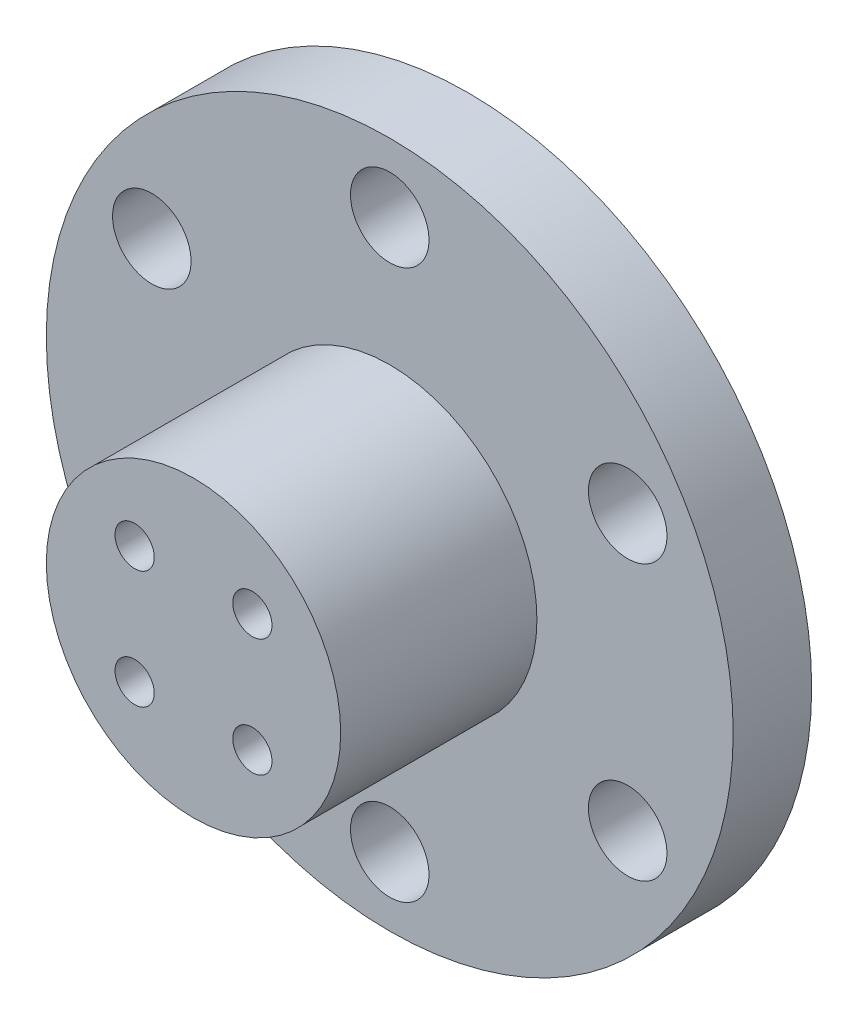
ISO-10303-21;
HEADER;
FILE_DESCRIPTION(('STEP AP214'),'2;1');
FILE_NAME('part.step','',(''),(''),'','','');
FILE_SCHEMA(('AUTOMOTIVE_DESIGN { 1 0 10303 214 1 1 1 1 }'));
ENDSEC;
DATA;
#1=APPLICATION_CONTEXT('core data for automotive mechanical design processes');
#2=APPLICATION_PROTOCOL_DEFINITION('international standard','automotive_design',2000,#1);
#3=PRODUCT_CONTEXT('',#1,'mechanical');
#4=PRODUCT('Part','Part','',(#3));
#5=PRODUCT_RELATED_PRODUCT_CATEGORY('part','',(#4));
#6=PRODUCT_DEFINITION_FORMATION('','',#4);
#7=PRODUCT_DEFINITION_CONTEXT('part definition',#1,'design');
#8=PRODUCT_DEFINITION('design','',#6,#7);
#9=PRODUCT_DEFINITION_SHAPE('','',#8);
#10=(LENGTH_UNIT() NAMED_UNIT(*) SI_UNIT(.MILLI.,.METRE.));
#11=(NAMED_UNIT(*) PLANE_ANGLE_UNIT() SI_UNIT($,.RADIAN.));
#12=(NAMED_UNIT(*) SI_UNIT($,.STERADIAN.) SOLID_ANGLE_UNIT());
#13=UNCERTAINTY_MEASURE_WITH_UNIT(LENGTH_MEASURE(1.E-05),#10,'distance_accuracy_value','');
#14=(GEOMETRIC_REPRESENTATION_CONTEXT(3) GLOBAL_UNCERTAINTY_ASSIGNED_CONTEXT((#13)) GLOBAL_UNIT_ASSIGNED_CONTEXT((#10,
#11,#12)) REPRESENTATION_CONTEXT('',''));
#15=CARTESIAN_POINT('',(0.,0.,0.));
#16=DIRECTION('',(0.,0.,1.));
#17=DIRECTION('',(1.,0.,0.));
#18=AXIS2_PLACEMENT_3D('',#15,#16,#17);
#19=CARTESIAN_POINT('',(0.,0.,20.));
#20=DIRECTION('',(0.,0.,-1.));
#21=DIRECTION('',(-1.,0.,0.));
#22=AXIS2_PLACEMENT_3D('',#19,#20,#21);
#23=CYLINDRICAL_SURFACE('',#22,15.);
#24=CARTESIAN_POINT('',(0.,0.,20.));
#25=DIRECTION('',(0.,0.,1.));
#26=DIRECTION('',(1.,0.,0.));
#27=AXIS2_PLACEMENT_3D('',#24,#25,#26);
#28=CIRCLE('',#27,15.);
#29=CARTESIAN_POINT('',(15.,0.,20.));
#30=VERTEX_POINT('',#29);
#31=EDGE_CURVE('E41',#30,#30,#28,.T.);
#32=ORIENTED_EDGE('',*,*,#31,.F.);
#33=EDGE_LOOP('',(#32));
#34=FACE_BOUND('',#33,.T.);
#35=CARTESIAN_POINT('',(0.,0.,0.));
#36=DIRECTION('',(0.,0.,1.));
#37=DIRECTION('',(1.,0.,0.));
#38=AXIS2_PLACEMENT_3D('',#35,#36,#37);
#39=CIRCLE('',#38,15.);
#40=CARTESIAN_POINT('',(15.,0.,0.));
#41=VERTEX_POINT('',#40);
#42=EDGE_CURVE('E45',#41,#41,#39,.T.);
#43=ORIENTED_EDGE('',*,*,#42,.T.);
#44=EDGE_LOOP('',(#43));
#45=FACE_BOUND('',#44,.T.);
#46=ADVANCED_FACE('F30',(#34,#45),#23,.T.);
#47=CARTESIAN_POINT('',(0.,0.,20.));
#48=DIRECTION('',(0.,0.,1.));
#49=DIRECTION('',(1.,0.,0.));
#50=AXIS2_PLACEMENT_3D('',#47,#48,#49);
#51=PLANE('',#50);
#52=CARTESIAN_POINT('',(-6.,6.,20.));
#53=DIRECTION('',(0.,0.,1.));
#54=DIRECTION('',(-1.,0.,0.));
#55=AXIS2_PLACEMENT_3D('',#52,#53,#54);
#56=CIRCLE('',#55,2.);
#57=CARTESIAN_POINT('',(-8.,6.,20.));
#58=VERTEX_POINT('',#57);
#59=EDGE_CURVE('E109',#58,#58,#56,.T.);
#60=ORIENTED_EDGE('',*,*,#59,.F.);
#61=EDGE_LOOP('',(#60));
#62=FACE_BOUND('',#61,.T.);
#63=CARTESIAN_POINT('',(6.,-6.,20.));
#64=DIRECTION('',(0.,0.,1.));
#65=DIRECTION('',(-1.,0.,0.));
#66=AXIS2_PLACEMENT_3D('',#63,#64,#65);
#67=CIRCLE('',#66,2.);
#68=CARTESIAN_POINT('',(4.,-6.,20.));
#69=VERTEX_POINT('',#68);
#70=EDGE_CURVE('E102',#69,#69,#67,.T.);
#71=ORIENTED_EDGE('',*,*,#70,.F.);
#72=EDGE_LOOP('',(#71));
#73=FACE_BOUND('',#72,.T.);
#74=CARTESIAN_POINT('',(-6.,-6.,20.));
#75=DIRECTION('',(0.,0.,1.));
#76=DIRECTION('',(1.,0.,0.));
#77=AXIS2_PLACEMENT_3D('',#74,#75,#76);
#78=CIRCLE('',#77,2.);
#79=CARTESIAN_POINT('',(-4.,-6.,20.));
#80=VERTEX_POINT('',#79);
#81=EDGE_CURVE('E114',#80,#80,#78,.T.);
#82=ORIENTED_EDGE('',*,*,#81,.F.);
#83=EDGE_LOOP('',(#82));
#84=FACE_BOUND('',#83,.T.);
#85=CARTESIAN_POINT('',(6.,6.,20.));
#86=DIRECTION('',(0.,0.,1.));
#87=DIRECTION('',(1.,0.,0.));
#88=AXIS2_PLACEMENT_3D('',#85,#86,#87);
#89=CIRCLE('',#88,2.);
#90=CARTESIAN_POINT('',(8.,6.,20.));
#91=VERTEX_POINT('',#90);
#92=EDGE_CURVE('E96',#91,#91,#89,.T.);
#93=ORIENTED_EDGE('',*,*,#92,.F.);
#94=EDGE_LOOP('',(#93));
#95=FACE_BOUND('',#94,.T.);
#96=ORIENTED_EDGE('',*,*,#31,.T.);
#97=EDGE_LOOP('',(#96));
#98=FACE_BOUND('',#97,.T.);
#99=ADVANCED_FACE('F129',(#62,#73,#84,#95,#98),#51,.T.);
#100=CARTESIAN_POINT('',(0.,0.,-8.));
#101=DIRECTION('',(0.,0.,1.));
#102=DIRECTION('',(1.,0.,0.));
#103=AXIS2_PLACEMENT_3D('',#100,#101,#102);
#104=CYLINDRICAL_SURFACE('',#103,35.);
#105=CARTESIAN_POINT('',(0.,0.,-8.));
#106=DIRECTION('',(0.,0.,-1.));
#107=DIRECTION('',(-1.,0.,0.));
#108=AXIS2_PLACEMENT_3D('',#105,#106,#107);
#109=CIRCLE('',#108,35.);
#110=CARTESIAN_POINT('',(-35.,0.,-8.));
#111=VERTEX_POINT('',#110);
#112=EDGE_CURVE('E49',#111,#111,#109,.T.);
#113=ORIENTED_EDGE('',*,*,#112,.F.);
#114=EDGE_LOOP('',(#113));
#115=FACE_BOUND('',#114,.T.);
#116=CARTESIAN_POINT('',(0.,0.,0.));
#117=DIRECTION('',(0.,0.,-1.));
#118=DIRECTION('',(-1.,0.,0.));
#119=AXIS2_PLACEMENT_3D('',#116,#117,#118);
#120=CIRCLE('',#119,35.);
#121=CARTESIAN_POINT('',(-35.,0.,0.));
#122=VERTEX_POINT('',#121);
#123=EDGE_CURVE('E51',#122,#122,#120,.T.);
#124=ORIENTED_EDGE('',*,*,#123,.T.);
#125=EDGE_LOOP('',(#124));
#126=FACE_BOUND('',#125,.T.);
#127=ADVANCED_FACE('F132',(#115,#126),#104,.T.);
#128=CARTESIAN_POINT('',(0.,0.,-8.));
#129=DIRECTION('',(0.,0.,-1.));
#130=DIRECTION('',(-1.,0.,0.));
#131=AXIS2_PLACEMENT_3D('',#128,#129,#130);
#132=PLANE('',#131);
#133=CARTESIAN_POINT('',(0.,0.,-8.));
#134=DIRECTION('',(0.,0.,-1.));
#135=DIRECTION('',(-1.,0.,0.));
#136=AXIS2_PLACEMENT_3D('',#133,#134,#135);
#137=CIRCLE('',#136,11.);
#138=CARTESIAN_POINT('',(-11.,0.,-8.));
#139=VERTEX_POINT('',#138);
#140=EDGE_CURVE('E86',#139,#139,#137,.T.);
#141=ORIENTED_EDGE('',*,*,#140,.F.);
#142=EDGE_LOOP('',(#141));
#143=FACE_BOUND('',#142,.T.);
#144=CARTESIAN_POINT('',(0.,28.,-8.));
#145=DIRECTION('',(0.,0.,-1.));
#146=DIRECTION('',(-1.,0.,0.));
#147=AXIS2_PLACEMENT_3D('',#144,#145,#146);
#148=CIRCLE('',#147,4.);
#149=CARTESIAN_POINT('',(-3.9999999999999,28.,-8.));
#150=VERTEX_POINT('',#149);
#151=EDGE_CURVE('E82',#150,#150,#148,.T.);
#152=ORIENTED_EDGE('',*,*,#151,.F.);
#153=EDGE_LOOP('',(#152));
#154=FACE_BOUND('',#153,.T.);
#155=CARTESIAN_POINT('',(24.2487113059638,13.999999999999,-8.));
#156=DIRECTION('',(0.,0.,-1.));
#157=DIRECTION('',(-1.,0.,0.));
#158=AXIS2_PLACEMENT_3D('',#155,#156,#157);
#159=CIRCLE('',#158,4.);
#160=CARTESIAN_POINT('',(20.2487113059638,13.999999999999,-8.));
#161=VERTEX_POINT('',#160);
#162=EDGE_CURVE('E83',#161,#161,#159,.T.);
#163=ORIENTED_EDGE('',*,*,#162,.F.);
#164=EDGE_LOOP('',(#163));
#165=FACE_BOUND('',#164,.T.);
#166=CARTESIAN_POINT('',(24.2487113059626,-14.000000000001,-8.));
#167=DIRECTION('',(0.,0.,-1.));
#168=DIRECTION('',(-1.,0.,0.));
#169=AXIS2_PLACEMENT_3D('',#166,#167,#168);
#170=CIRCLE('',#169,4.);
#171=CARTESIAN_POINT('',(20.2487113059626,-14.000000000001,-8.));
#172=VERTEX_POINT('',#171);
#173=EDGE_CURVE('E57',#172,#172,#170,.T.);
#174=ORIENTED_EDGE('',*,*,#173,.F.);
#175=EDGE_LOOP('',(#174));
#176=FACE_BOUND('',#175,.T.);
#177=CARTESIAN_POINT('',(-2.27744157613733E-12,-28.,-8.));
#178=DIRECTION('',(0.,0.,-1.));
#179=DIRECTION('',(-1.,0.,0.));
#180=AXIS2_PLACEMENT_3D('',#177,#178,#179);
#181=CIRCLE('',#180,4.);
#182=CARTESIAN_POINT('',(-4.00000000000228,-28.,-8.));
#183=VERTEX_POINT('',#182);
#184=EDGE_CURVE('E64',#183,#183,#181,.T.);
#185=ORIENTED_EDGE('',*,*,#184,.F.);
#186=EDGE_LOOP('',(#185));
#187=FACE_BOUND('',#186,.T.);
#188=CARTESIAN_POINT('',(-24.248711305966,-13.999999999999,-8.));
#189=DIRECTION('',(0.,0.,-1.));
#190=DIRECTION('',(-1.,0.,0.));
#191=AXIS2_PLACEMENT_3D('',#188,#189,#190);
#192=CIRCLE('',#191,4.);
#193=CARTESIAN_POINT('',(-28.248711305966,-13.999999999999,-8.));
#194=VERTEX_POINT('',#193);
#195=EDGE_CURVE('E70',#194,#194,#192,.T.);
#196=ORIENTED_EDGE('',*,*,#195,.F.);
#197=EDGE_LOOP('',(#196));
#198=FACE_BOUND('',#197,.T.);
#199=CARTESIAN_POINT('',(-24.2487113059648,14.000000000001,-8.));
#200=DIRECTION('',(0.,0.,-1.));
#201=DIRECTION('',(-1.,0.,0.));
#202=AXIS2_PLACEMENT_3D('',#199,#200,#201);
#203=CIRCLE('',#202,4.);
#204=CARTESIAN_POINT('',(-28.2487113059648,14.000000000001,-8.));
#205=VERTEX_POINT('',#204);
#206=EDGE_CURVE('E76',#205,#205,#203,.T.);
#207=ORIENTED_EDGE('',*,*,#206,.F.);
#208=EDGE_LOOP('',(#207));
#209=FACE_BOUND('',#208,.T.);
#210=ORIENTED_EDGE('',*,*,#112,.T.);
#211=EDGE_LOOP('',(#210));
#212=FACE_BOUND('',#211,.T.);
#213=ADVANCED_FACE('F147',(#143,#154,#165,#176,#187,#198,#209,#212),#132,.T.);
#214=CARTESIAN_POINT('',(0.,0.,0.));
#215=DIRECTION('',(0.,0.,-1.));
#216=DIRECTION('',(-1.,0.,0.));
#217=AXIS2_PLACEMENT_3D('',#214,#215,#216);
#218=PLANE('',#217);
#219=CARTESIAN_POINT('',(0.,28.,0.));
#220=DIRECTION('',(0.,0.,-1.));
#221=DIRECTION('',(-1.,0.,0.));
#222=AXIS2_PLACEMENT_3D('',#219,#220,#221);
#223=CIRCLE('',#222,4.);
#224=CARTESIAN_POINT('',(-3.9999999999999,28.,0.));
#225=VERTEX_POINT('',#224);
#226=EDGE_CURVE('E54',#225,#225,#223,.T.);
#227=ORIENTED_EDGE('',*,*,#226,.T.);
#228=EDGE_LOOP('',(#227));
#229=FACE_BOUND('',#228,.T.);
#230=CARTESIAN_POINT('',(24.2487113059638,13.999999999999,0.));
#231=DIRECTION('',(0.,0.,-1.));
#232=DIRECTION('',(-1.,0.,0.));
#233=AXIS2_PLACEMENT_3D('',#230,#231,#232);
#234=CIRCLE('',#233,4.);
#235=CARTESIAN_POINT('',(20.2487113059638,13.999999999999,0.));
#236=VERTEX_POINT('',#235);
#237=EDGE_CURVE('E61',#236,#236,#234,.T.);
#238=ORIENTED_EDGE('',*,*,#237,.T.);
#239=EDGE_LOOP('',(#238));
#240=FACE_BOUND('',#239,.T.);
#241=CARTESIAN_POINT('',(24.2487113059626,-14.000000000001,0.));
#242=DIRECTION('',(0.,0.,-1.));
#243=DIRECTION('',(-1.,0.,0.));
#244=AXIS2_PLACEMENT_3D('',#241,#242,#243);
#245=CIRCLE('',#244,4.);
#246=CARTESIAN_POINT('',(20.2487113059626,-14.000000000001,0.));
#247=VERTEX_POINT('',#246);
#248=EDGE_CURVE('E60',#247,#247,#245,.T.);
#249=ORIENTED_EDGE('',*,*,#248,.T.);
#250=EDGE_LOOP('',(#249));
#251=FACE_BOUND('',#250,.T.);
#252=CARTESIAN_POINT('',(-2.27744157613733E-12,-28.,0.));
#253=DIRECTION('',(0.,0.,-1.));
#254=DIRECTION('',(-1.,0.,0.));
#255=AXIS2_PLACEMENT_3D('',#252,#253,#254);
#256=CIRCLE('',#255,4.);
#257=CARTESIAN_POINT('',(-4.00000000000228,-28.,0.));
#258=VERTEX_POINT('',#257);
#259=EDGE_CURVE('E67',#258,#258,#256,.T.);
#260=ORIENTED_EDGE('',*,*,#259,.T.);
#261=EDGE_LOOP('',(#260));
#262=FACE_BOUND('',#261,.T.);
#263=CARTESIAN_POINT('',(-24.248711305966,-13.999999999999,0.));
#264=DIRECTION('',(0.,0.,-1.));
#265=DIRECTION('',(-1.,0.,0.));
#266=AXIS2_PLACEMENT_3D('',#263,#264,#265);
#267=CIRCLE('',#266,4.);
#268=CARTESIAN_POINT('',(-28.248711305966,-13.999999999999,0.));
#269=VERTEX_POINT('',#268);
#270=EDGE_CURVE('E73',#269,#269,#267,.T.);
#271=ORIENTED_EDGE('',*,*,#270,.T.);
#272=EDGE_LOOP('',(#271));
#273=FACE_BOUND('',#272,.T.);
#274=CARTESIAN_POINT('',(-24.2487113059648,14.000000000001,0.));
#275=DIRECTION('',(0.,0.,-1.));
#276=DIRECTION('',(-1.,0.,0.));
#277=AXIS2_PLACEMENT_3D('',#274,#275,#276);
#278=CIRCLE('',#277,4.);
#279=CARTESIAN_POINT('',(-28.2487113059648,14.000000000001,0.));
#280=VERTEX_POINT('',#279);
#281=EDGE_CURVE('E79',#280,#280,#278,.T.);
#282=ORIENTED_EDGE('',*,*,#281,.T.);
#283=EDGE_LOOP('',(#282));
#284=FACE_BOUND('',#283,.T.);
#285=ORIENTED_EDGE('',*,*,#42,.F.);
#286=EDGE_LOOP('',(#285));
#287=FACE_BOUND('',#286,.T.);
#288=ORIENTED_EDGE('',*,*,#123,.F.);
#289=EDGE_LOOP('',(#288));
#290=FACE_BOUND('',#289,.T.);
#291=ADVANCED_FACE('F143',(#229,#240,#251,#262,#273,#284,#287,#290),#218,.F.);
#292=CARTESIAN_POINT('',(-24.2487113059648,14.000000000001,0.));
#293=DIRECTION('',(0.,0.,-1.));
#294=DIRECTION('',(-1.,0.,0.));
#295=AXIS2_PLACEMENT_3D('',#292,#293,#294);
#296=CYLINDRICAL_SURFACE('',#295,4.);
#297=ORIENTED_EDGE('',*,*,#281,.F.);
#298=EDGE_LOOP('',(#297));
#299=FACE_BOUND('',#298,.T.);
#300=ORIENTED_EDGE('',*,*,#206,.T.);
#301=EDGE_LOOP('',(#300));
#302=FACE_BOUND('',#301,.T.);
#303=ADVANCED_FACE('F146',(#299,#302),#296,.F.);
#304=CARTESIAN_POINT('',(-24.248711305966,-13.999999999999,0.));
#305=DIRECTION('',(0.,0.,-1.));
#306=DIRECTION('',(-1.,0.,0.));
#307=AXIS2_PLACEMENT_3D('',#304,#305,#306);
#308=CYLINDRICAL_SURFACE('',#307,4.);
#309=ORIENTED_EDGE('',*,*,#270,.F.);
#310=EDGE_LOOP('',(#309));
#311=FACE_BOUND('',#310,.T.);
#312=ORIENTED_EDGE('',*,*,#195,.T.);
#313=EDGE_LOOP('',(#312));
#314=FACE_BOUND('',#313,.T.);
#315=ADVANCED_FACE('F170',(#311,#314),#308,.F.);
#316=CARTESIAN_POINT('',(-2.27744157613733E-12,-28.,0.));
#317=DIRECTION('',(0.,0.,-1.));
#318=DIRECTION('',(-1.,0.,0.));
#319=AXIS2_PLACEMENT_3D('',#316,#317,#318);
#320=CYLINDRICAL_SURFACE('',#319,4.);
#321=ORIENTED_EDGE('',*,*,#259,.F.);
#322=EDGE_LOOP('',(#321));
#323=FACE_BOUND('',#322,.T.);
#324=ORIENTED_EDGE('',*,*,#184,.T.);
#325=EDGE_LOOP('',(#324));
#326=FACE_BOUND('',#325,.T.);
#327=ADVANCED_FACE('F166',(#323,#326),#320,.F.);
#328=CARTESIAN_POINT('',(24.2487113059626,-14.000000000001,0.));
#329=DIRECTION('',(0.,0.,-1.));
#330=DIRECTION('',(-1.,0.,0.));
#331=AXIS2_PLACEMENT_3D('',#328,#329,#330);
#332=CYLINDRICAL_SURFACE('',#331,4.);
#333=ORIENTED_EDGE('',*,*,#248,.F.);
#334=EDGE_LOOP('',(#333));
#335=FACE_BOUND('',#334,.T.);
#336=ORIENTED_EDGE('',*,*,#173,.T.);
#337=EDGE_LOOP('',(#336));
#338=FACE_BOUND('',#337,.T.);
#339=ADVANCED_FACE('F162',(#335,#338),#332,.F.);
#340=CARTESIAN_POINT('',(24.2487113059638,13.999999999999,0.));
#341=DIRECTION('',(0.,0.,-1.));
#342=DIRECTION('',(-1.,0.,0.));
#343=AXIS2_PLACEMENT_3D('',#340,#341,#342);
#344=CYLINDRICAL_SURFACE('',#343,4.);
#345=ORIENTED_EDGE('',*,*,#237,.F.);
#346=EDGE_LOOP('',(#345));
#347=FACE_BOUND('',#346,.T.);
#348=ORIENTED_EDGE('',*,*,#162,.T.);
#349=EDGE_LOOP('',(#348));
#350=FACE_BOUND('',#349,.T.);
#351=ADVANCED_FACE('F165',(#347,#350),#344,.F.);
#352=CARTESIAN_POINT('',(0.,28.,0.));
#353=DIRECTION('',(0.,0.,-1.));
#354=DIRECTION('',(-1.,0.,0.));
#355=AXIS2_PLACEMENT_3D('',#352,#353,#354);
#356=CYLINDRICAL_SURFACE('',#355,4.);
#357=ORIENTED_EDGE('',*,*,#226,.F.);
#358=EDGE_LOOP('',(#357));
#359=FACE_BOUND('',#358,.T.);
#360=ORIENTED_EDGE('',*,*,#151,.T.);
#361=EDGE_LOOP('',(#360));
#362=FACE_BOUND('',#361,.T.);
#363=ADVANCED_FACE('F180',(#359,#362),#356,.F.);
#364=CARTESIAN_POINT('',(0.,0.,0.));
#365=DIRECTION('',(0.,0.,-1.));
#366=DIRECTION('',(-1.,0.,0.));
#367=AXIS2_PLACEMENT_3D('',#364,#365,#366);
#368=CYLINDRICAL_SURFACE('',#367,11.);
#369=CARTESIAN_POINT('',(0.,0.,-1.));
#370=DIRECTION('',(0.,0.,-1.));
#371=DIRECTION('',(-1.,0.,0.));
#372=AXIS2_PLACEMENT_3D('',#369,#370,#371);
#373=CIRCLE('',#372,11.);
#374=CARTESIAN_POINT('',(-11.,0.,-1.));
#375=VERTEX_POINT('',#374);
#376=EDGE_CURVE('E10',#375,#375,#373,.F.);
#377=ORIENTED_EDGE('',*,*,#376,.T.);
#378=EDGE_LOOP('',(#377));
#379=FACE_BOUND('',#378,.T.);
#380=ORIENTED_EDGE('',*,*,#140,.T.);
#381=EDGE_LOOP('',(#380));
#382=FACE_BOUND('',#381,.T.);
#383=ADVANCED_FACE('F184',(#379,#382),#368,.F.);
#384=CARTESIAN_POINT('',(0.,0.,0.));
#385=DIRECTION('',(0.,0.,-1.));
#386=DIRECTION('',(-1.,0.,0.));
#387=AXIS2_PLACEMENT_3D('',#384,#385,#386);
#388=PLANE('',#387);
#389=CARTESIAN_POINT('',(0.,0.,0.));
#390=DIRECTION('',(0.,0.,-1.));
#391=DIRECTION('',(-1.,0.,0.));
#392=AXIS2_PLACEMENT_3D('',#389,#390,#391);
#393=CIRCLE('',#392,10.);
#394=CARTESIAN_POINT('',(-10.,0.,0.));
#395=VERTEX_POINT('',#394);
#396=EDGE_CURVE('E37',#395,#395,#393,.T.);
#397=ORIENTED_EDGE('',*,*,#396,.T.);
#398=EDGE_LOOP('',(#397));
#399=FACE_BOUND('',#398,.T.);
#400=ADVANCED_FACE('F188',(#399),#388,.T.);
#401=CARTESIAN_POINT('',(6.,6.,5.));
#402=DIRECTION('',(0.,0.,1.));
#403=DIRECTION('',(1.,0.,0.));
#404=AXIS2_PLACEMENT_3D('',#401,#402,#403);
#405=CYLINDRICAL_SURFACE('',#404,2.);
#406=CARTESIAN_POINT('',(6.,6.,5.));
#407=DIRECTION('',(0.,0.,1.));
#408=DIRECTION('',(1.,0.,0.));
#409=AXIS2_PLACEMENT_3D('',#406,#407,#408);
#410=CIRCLE('',#409,2.);
#411=CARTESIAN_POINT('',(8.,6.,5.));
#412=VERTEX_POINT('',#411);
#413=EDGE_CURVE('E95',#412,#412,#410,.T.);
#414=ORIENTED_EDGE('',*,*,#413,.F.);
#415=EDGE_LOOP('',(#414));
#416=FACE_BOUND('',#415,.T.);
#417=ORIENTED_EDGE('',*,*,#92,.T.);
#418=EDGE_LOOP('',(#417));
#419=FACE_BOUND('',#418,.T.);
#420=ADVANCED_FACE('F191',(#416,#419),#405,.F.);
#421=CARTESIAN_POINT('',(6.,6.,5.));
#422=DIRECTION('',(0.,0.,1.));
#423=DIRECTION('',(1.,0.,0.));
#424=AXIS2_PLACEMENT_3D('',#421,#422,#423);
#425=PLANE('',#424);
#426=ORIENTED_EDGE('',*,*,#413,.T.);
#427=EDGE_LOOP('',(#426));
#428=FACE_BOUND('',#427,.T.);
#429=ADVANCED_FACE('F125',(#428),#425,.T.);
#430=CARTESIAN_POINT('',(-6.,-6.,5.));
#431=DIRECTION('',(0.,0.,1.));
#432=DIRECTION('',(1.,0.,0.));
#433=AXIS2_PLACEMENT_3D('',#430,#431,#432);
#434=CYLINDRICAL_SURFACE('',#433,2.);
#435=CARTESIAN_POINT('',(-6.,-6.,5.));
#436=DIRECTION('',(0.,0.,1.));
#437=DIRECTION('',(1.,0.,0.));
#438=AXIS2_PLACEMENT_3D('',#435,#436,#437);
#439=CIRCLE('',#438,2.);
#440=CARTESIAN_POINT('',(-4.,-6.,5.));
#441=VERTEX_POINT('',#440);
#442=EDGE_CURVE('E106',#441,#441,#439,.T.);
#443=ORIENTED_EDGE('',*,*,#442,.F.);
#444=EDGE_LOOP('',(#443));
#445=FACE_BOUND('',#444,.T.);
#446=ORIENTED_EDGE('',*,*,#81,.T.);
#447=EDGE_LOOP('',(#446));
#448=FACE_BOUND('',#447,.T.);
#449=ADVANCED_FACE('F122',(#445,#448),#434,.F.);
#450=CARTESIAN_POINT('',(-6.,-6.,5.));
#451=DIRECTION('',(0.,0.,1.));
#452=DIRECTION('',(1.,0.,0.));
#453=AXIS2_PLACEMENT_3D('',#450,#451,#452);
#454=PLANE('',#453);
#455=ORIENTED_EDGE('',*,*,#442,.T.);
#456=EDGE_LOOP('',(#455));
#457=FACE_BOUND('',#456,.T.);
#458=ADVANCED_FACE('F120',(#457),#454,.T.);
#459=CARTESIAN_POINT('',(6.,-6.,5.));
#460=DIRECTION('',(0.,0.,1.));
#461=DIRECTION('',(1.,0.,0.));
#462=AXIS2_PLACEMENT_3D('',#459,#460,#461);
#463=CYLINDRICAL_SURFACE('',#462,2.);
#464=CARTESIAN_POINT('',(6.,-6.,5.));
#465=DIRECTION('',(0.,0.,1.));
#466=DIRECTION('',(-1.,0.,0.));
#467=AXIS2_PLACEMENT_3D('',#464,#465,#466);
#468=CIRCLE('',#467,2.);
#469=CARTESIAN_POINT('',(4.,-6.,5.));
#470=VERTEX_POINT('',#469);
#471=EDGE_CURVE('E105',#470,#470,#468,.T.);
#472=ORIENTED_EDGE('',*,*,#471,.F.);
#473=EDGE_LOOP('',(#472));
#474=FACE_BOUND('',#473,.T.);
#475=ORIENTED_EDGE('',*,*,#70,.T.);
#476=EDGE_LOOP('',(#475));
#477=FACE_BOUND('',#476,.T.);
#478=ADVANCED_FACE('F198',(#474,#477),#463,.F.);
#479=CARTESIAN_POINT('',(6.,-6.,5.));
#480=DIRECTION('',(0.,0.,-1.));
#481=DIRECTION('',(-1.,0.,0.));
#482=AXIS2_PLACEMENT_3D('',#479,#480,#481);
#483=PLANE('',#482);
#484=ORIENTED_EDGE('',*,*,#471,.T.);
#485=EDGE_LOOP('',(#484));
#486=FACE_BOUND('',#485,.T.);
#487=ADVANCED_FACE('F201',(#486),#483,.F.);
#488=CARTESIAN_POINT('',(-6.,6.,5.));
#489=DIRECTION('',(0.,0.,1.));
#490=DIRECTION('',(1.,0.,0.));
#491=AXIS2_PLACEMENT_3D('',#488,#489,#490);
#492=CYLINDRICAL_SURFACE('',#491,2.);
#493=CARTESIAN_POINT('',(-6.,6.,5.));
#494=DIRECTION('',(0.,0.,1.));
#495=DIRECTION('',(-1.,0.,0.));
#496=AXIS2_PLACEMENT_3D('',#493,#494,#495);
#497=CIRCLE('',#496,2.);
#498=CARTESIAN_POINT('',(-8.,6.,5.));
#499=VERTEX_POINT('',#498);
#500=EDGE_CURVE('E99',#499,#499,#497,.T.);
#501=ORIENTED_EDGE('',*,*,#500,.F.);
#502=EDGE_LOOP('',(#501));
#503=FACE_BOUND('',#502,.T.);
#504=ORIENTED_EDGE('',*,*,#59,.T.);
#505=EDGE_LOOP('',(#504));
#506=FACE_BOUND('',#505,.T.);
#507=ADVANCED_FACE('F205',(#503,#506),#492,.F.);
#508=CARTESIAN_POINT('',(-6.,6.,5.));
#509=DIRECTION('',(0.,0.,-1.));
#510=DIRECTION('',(-1.,0.,0.));
#511=AXIS2_PLACEMENT_3D('',#508,#509,#510);
#512=PLANE('',#511);
#513=ORIENTED_EDGE('',*,*,#500,.T.);
#514=EDGE_LOOP('',(#513));
#515=FACE_BOUND('',#514,.T.);
#516=ADVANCED_FACE('F209',(#515),#512,.F.);
#517=CARTESIAN_POINT('',(0.,0.,-1.));
#518=DIRECTION('',(0.,0.,-1.));
#519=DIRECTION('',(-1.,0.,0.));
#520=AXIS2_PLACEMENT_3D('',#517,#518,#519);
#521=TOROIDAL_SURFACE('',#520,10.,1.);
#522=ORIENTED_EDGE('',*,*,#376,.F.);
#523=EDGE_LOOP('',(#522));
#524=FACE_BOUND('',#523,.T.);
#525=ORIENTED_EDGE('',*,*,#396,.F.);
#526=EDGE_LOOP('',(#525));
#527=FACE_BOUND('',#526,.T.);
#528=ADVANCED_FACE('F32',(#524,#527),#521,.F.);
#529=CLOSED_SHELL('',(#46,#99,#127,#213,#291,#303,#315,#327,#339,#351,#363,#383,#400,#420,#429,
#449,#458,#478,#487,#507,#516,#528));
#530=MANIFOLD_SOLID_BREP('B2',#529);
#531=ADVANCED_BREP_SHAPE_REPRESENTATION('',(#18,#530),#14);
#532=SHAPE_DEFINITION_REPRESENTATION(#9,#531);
ENDSEC;
END-ISO-10303-21;
